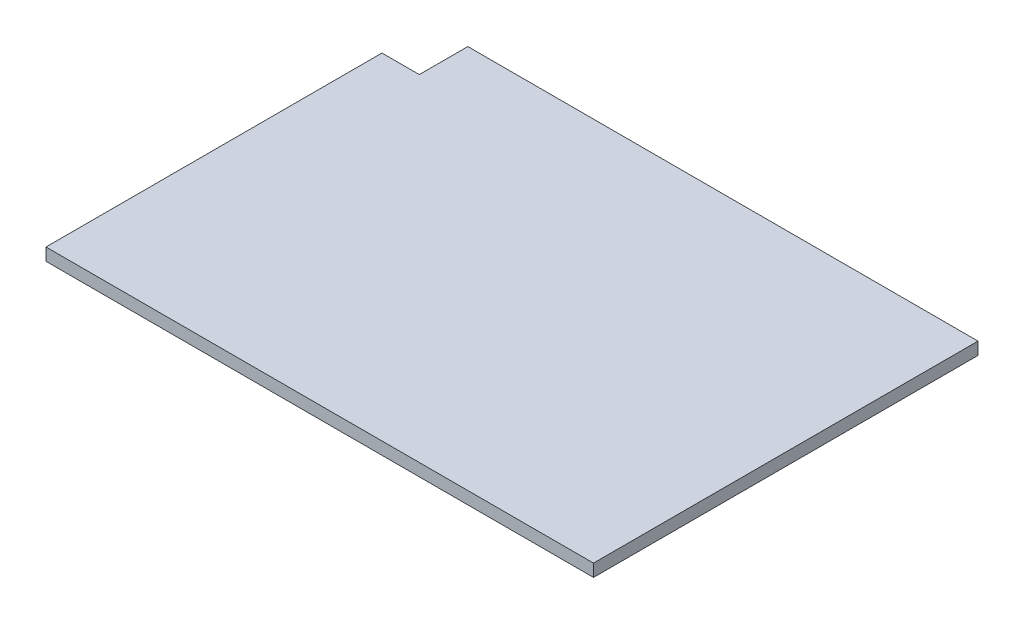
ISO-10303-21;
HEADER;
FILE_DESCRIPTION(('STEP AP214'),'2;1');
FILE_NAME('part.step','',(''),(''),'','','');
FILE_SCHEMA(('AUTOMOTIVE_DESIGN { 1 0 10303 214 1 1 1 1 }'));
ENDSEC;
DATA;
#1=APPLICATION_CONTEXT('core data for automotive mechanical design processes');
#2=APPLICATION_PROTOCOL_DEFINITION('international standard','automotive_design',2000,#1);
#3=PRODUCT_CONTEXT('',#1,'mechanical');
#4=PRODUCT('Part','Part','',(#3));
#5=PRODUCT_RELATED_PRODUCT_CATEGORY('part','',(#4));
#6=PRODUCT_DEFINITION_FORMATION('','',#4);
#7=PRODUCT_DEFINITION_CONTEXT('part definition',#1,'design');
#8=PRODUCT_DEFINITION('design','',#6,#7);
#9=PRODUCT_DEFINITION_SHAPE('','',#8);
#10=(LENGTH_UNIT() NAMED_UNIT(*) SI_UNIT(.MILLI.,.METRE.));
#11=(NAMED_UNIT(*) PLANE_ANGLE_UNIT() SI_UNIT($,.RADIAN.));
#12=(NAMED_UNIT(*) SI_UNIT($,.STERADIAN.) SOLID_ANGLE_UNIT());
#13=UNCERTAINTY_MEASURE_WITH_UNIT(LENGTH_MEASURE(1.E-05),#10,'distance_accuracy_value','');
#14=(GEOMETRIC_REPRESENTATION_CONTEXT(3) GLOBAL_UNCERTAINTY_ASSIGNED_CONTEXT((#13)) GLOBAL_UNIT_ASSIGNED_CONTEXT((#10,
#11,#12)) REPRESENTATION_CONTEXT('',''));
#15=CARTESIAN_POINT('',(0.,0.,0.));
#16=DIRECTION('',(0.,0.,1.));
#17=DIRECTION('',(1.,0.,0.));
#18=AXIS2_PLACEMENT_3D('',#15,#16,#17);
#19=CARTESIAN_POINT('',(0.,10.,0.));
#20=DIRECTION('',(1.,0.,0.));
#21=DIRECTION('',(0.,0.,-1.));
#22=AXIS2_PLACEMENT_3D('',#19,#20,#21);
#23=PLANE('',#22);
#24=DIRECTION('',(0.,0.,1.));
#25=VECTOR('',#24,1.);
#26=CARTESIAN_POINT('',(0.,0.,0.));
#27=LINE('',#26,#25);
#28=CARTESIAN_POINT('',(0.,0.,-270.));
#29=VERTEX_POINT('',#28);
#30=CARTESIAN_POINT('',(0.,0.,0.));
#31=VERTEX_POINT('',#30);
#32=EDGE_CURVE('E128',#29,#31,#27,.T.);
#33=ORIENTED_EDGE('',*,*,#32,.T.);
#34=DIRECTION('',(0.,-1.,0.));
#35=VECTOR('',#34,1.);
#36=CARTESIAN_POINT('',(0.,10.,0.));
#37=LINE('',#36,#35);
#38=CARTESIAN_POINT('',(0.,10.,0.));
#39=VERTEX_POINT('',#38);
#40=EDGE_CURVE('E11',#39,#31,#37,.T.);
#41=ORIENTED_EDGE('',*,*,#40,.F.);
#42=DIRECTION('',(0.,0.,1.));
#43=VECTOR('',#42,1.);
#44=CARTESIAN_POINT('',(0.,10.,0.));
#45=LINE('',#44,#43);
#46=CARTESIAN_POINT('',(0.,10.,-270.));
#47=VERTEX_POINT('',#46);
#48=EDGE_CURVE('E144',#47,#39,#45,.T.);
#49=ORIENTED_EDGE('',*,*,#48,.F.);
#50=DIRECTION('',(0.,-1.,0.));
#51=VECTOR('',#50,1.);
#52=CARTESIAN_POINT('',(0.,10.,-270.));
#53=LINE('',#52,#51);
#54=EDGE_CURVE('E124',#47,#29,#53,.T.);
#55=ORIENTED_EDGE('',*,*,#54,.T.);
#56=EDGE_LOOP('',(#33,#41,#49,#55));
#57=FACE_BOUND('',#56,.T.);
#58=ADVANCED_FACE('F39',(#57),#23,.F.);
#59=CARTESIAN_POINT('',(0.,10.,0.));
#60=DIRECTION('',(0.,0.,-1.));
#61=DIRECTION('',(-1.,0.,0.));
#62=AXIS2_PLACEMENT_3D('',#59,#60,#61);
#63=PLANE('',#62);
#64=DIRECTION('',(1.,0.,0.));
#65=VECTOR('',#64,1.);
#66=CARTESIAN_POINT('',(0.,0.,0.));
#67=LINE('',#66,#65);
#68=CARTESIAN_POINT('',(440.,0.,0.));
#69=VERTEX_POINT('',#68);
#70=EDGE_CURVE('E132',#31,#69,#67,.T.);
#71=ORIENTED_EDGE('',*,*,#70,.T.);
#72=DIRECTION('',(0.,-1.,0.));
#73=VECTOR('',#72,1.);
#74=CARTESIAN_POINT('',(440.,10.,0.));
#75=LINE('',#74,#73);
#76=CARTESIAN_POINT('',(440.,10.,0.));
#77=VERTEX_POINT('',#76);
#78=EDGE_CURVE('E48',#77,#69,#75,.T.);
#79=ORIENTED_EDGE('',*,*,#78,.F.);
#80=DIRECTION('',(1.,0.,0.));
#81=VECTOR('',#80,1.);
#82=CARTESIAN_POINT('',(0.,10.,0.));
#83=LINE('',#82,#81);
#84=EDGE_CURVE('E93',#39,#77,#83,.T.);
#85=ORIENTED_EDGE('',*,*,#84,.F.);
#86=ORIENTED_EDGE('',*,*,#40,.T.);
#87=EDGE_LOOP('',(#71,#79,#85,#86));
#88=FACE_BOUND('',#87,.T.);
#89=ADVANCED_FACE('F172',(#88),#63,.F.);
#90=CARTESIAN_POINT('',(440.,10.,0.));
#91=DIRECTION('',(-1.,0.,0.));
#92=DIRECTION('',(0.,0.,1.));
#93=AXIS2_PLACEMENT_3D('',#90,#91,#92);
#94=PLANE('',#93);
#95=DIRECTION('',(0.,0.,-1.));
#96=VECTOR('',#95,1.);
#97=CARTESIAN_POINT('',(440.,0.,0.));
#98=LINE('',#97,#96);
#99=CARTESIAN_POINT('',(440.,0.,-309.));
#100=VERTEX_POINT('',#99);
#101=EDGE_CURVE('E135',#69,#100,#98,.T.);
#102=ORIENTED_EDGE('',*,*,#101,.T.);
#103=DIRECTION('',(0.,-1.,0.));
#104=VECTOR('',#103,1.);
#105=CARTESIAN_POINT('',(440.,10.,-309.));
#106=LINE('',#105,#104);
#107=CARTESIAN_POINT('',(440.,10.,-309.));
#108=VERTEX_POINT('',#107);
#109=EDGE_CURVE('E117',#108,#100,#106,.T.);
#110=ORIENTED_EDGE('',*,*,#109,.F.);
#111=DIRECTION('',(0.,0.,-1.));
#112=VECTOR('',#111,1.);
#113=CARTESIAN_POINT('',(440.,10.,0.));
#114=LINE('',#113,#112);
#115=EDGE_CURVE('E106',#77,#108,#114,.T.);
#116=ORIENTED_EDGE('',*,*,#115,.F.);
#117=ORIENTED_EDGE('',*,*,#78,.T.);
#118=EDGE_LOOP('',(#102,#110,#116,#117));
#119=FACE_BOUND('',#118,.T.);
#120=ADVANCED_FACE('F154',(#119),#94,.F.);
#121=CARTESIAN_POINT('',(30.,10.,-309.));
#122=DIRECTION('',(0.,0.,1.));
#123=DIRECTION('',(1.,0.,0.));
#124=AXIS2_PLACEMENT_3D('',#121,#122,#123);
#125=PLANE('',#124);
#126=DIRECTION('',(-1.,0.,0.));
#127=VECTOR('',#126,1.);
#128=CARTESIAN_POINT('',(30.,0.,-309.));
#129=LINE('',#128,#127);
#130=CARTESIAN_POINT('',(30.,0.,-309.));
#131=VERTEX_POINT('',#130);
#132=EDGE_CURVE('E115',#100,#131,#129,.T.);
#133=ORIENTED_EDGE('',*,*,#132,.T.);
#134=DIRECTION('',(0.,-1.,0.));
#135=VECTOR('',#134,1.);
#136=CARTESIAN_POINT('',(30.,10.,-309.));
#137=LINE('',#136,#135);
#138=CARTESIAN_POINT('',(30.,10.,-309.));
#139=VERTEX_POINT('',#138);
#140=EDGE_CURVE('E112',#139,#131,#137,.T.);
#141=ORIENTED_EDGE('',*,*,#140,.F.);
#142=DIRECTION('',(-1.,0.,0.));
#143=VECTOR('',#142,1.);
#144=CARTESIAN_POINT('',(30.,10.,-309.));
#145=LINE('',#144,#143);
#146=EDGE_CURVE('E100',#108,#139,#145,.T.);
#147=ORIENTED_EDGE('',*,*,#146,.F.);
#148=ORIENTED_EDGE('',*,*,#109,.T.);
#149=EDGE_LOOP('',(#133,#141,#147,#148));
#150=FACE_BOUND('',#149,.T.);
#151=ADVANCED_FACE('F113',(#150),#125,.F.);
#152=CARTESIAN_POINT('',(30.,10.,-309.));
#153=DIRECTION('',(1.,0.,0.));
#154=DIRECTION('',(0.,0.,-1.));
#155=AXIS2_PLACEMENT_3D('',#152,#153,#154);
#156=PLANE('',#155);
#157=DIRECTION('',(0.,0.,1.));
#158=VECTOR('',#157,1.);
#159=CARTESIAN_POINT('',(30.,0.,-309.));
#160=LINE('',#159,#158);
#161=CARTESIAN_POINT('',(30.,0.,-270.));
#162=VERTEX_POINT('',#161);
#163=EDGE_CURVE('E79',#131,#162,#160,.T.);
#164=ORIENTED_EDGE('',*,*,#163,.T.);
#165=DIRECTION('',(0.,-1.,0.));
#166=VECTOR('',#165,1.);
#167=CARTESIAN_POINT('',(30.,10.,-270.));
#168=LINE('',#167,#166);
#169=CARTESIAN_POINT('',(30.,10.,-270.));
#170=VERTEX_POINT('',#169);
#171=EDGE_CURVE('E118',#170,#162,#168,.T.);
#172=ORIENTED_EDGE('',*,*,#171,.F.);
#173=DIRECTION('',(0.,0.,1.));
#174=VECTOR('',#173,1.);
#175=CARTESIAN_POINT('',(30.,10.,-309.));
#176=LINE('',#175,#174);
#177=EDGE_CURVE('E104',#139,#170,#176,.T.);
#178=ORIENTED_EDGE('',*,*,#177,.F.);
#179=ORIENTED_EDGE('',*,*,#140,.T.);
#180=EDGE_LOOP('',(#164,#172,#178,#179));
#181=FACE_BOUND('',#180,.T.);
#182=ADVANCED_FACE('F120',(#181),#156,.F.);
#183=CARTESIAN_POINT('',(0.,10.,-270.));
#184=DIRECTION('',(0.,0.,1.));
#185=DIRECTION('',(1.,0.,0.));
#186=AXIS2_PLACEMENT_3D('',#183,#184,#185);
#187=PLANE('',#186);
#188=DIRECTION('',(-1.,0.,0.));
#189=VECTOR('',#188,1.);
#190=CARTESIAN_POINT('',(0.,0.,-270.));
#191=LINE('',#190,#189);
#192=EDGE_CURVE('E85',#162,#29,#191,.T.);
#193=ORIENTED_EDGE('',*,*,#192,.T.);
#194=ORIENTED_EDGE('',*,*,#54,.F.);
#195=DIRECTION('',(-1.,0.,0.));
#196=VECTOR('',#195,1.);
#197=CARTESIAN_POINT('',(0.,10.,-270.));
#198=LINE('',#197,#196);
#199=EDGE_CURVE('E56',#170,#47,#198,.T.);
#200=ORIENTED_EDGE('',*,*,#199,.F.);
#201=ORIENTED_EDGE('',*,*,#171,.T.);
#202=EDGE_LOOP('',(#193,#194,#200,#201));
#203=FACE_BOUND('',#202,.T.);
#204=ADVANCED_FACE('F161',(#203),#187,.F.);
#205=CARTESIAN_POINT('',(0.,10.,0.));
#206=DIRECTION('',(0.,-1.,0.));
#207=DIRECTION('',(0.,0.,-1.));
#208=AXIS2_PLACEMENT_3D('',#205,#206,#207);
#209=PLANE('',#208);
#210=ORIENTED_EDGE('',*,*,#48,.T.);
#211=ORIENTED_EDGE('',*,*,#84,.T.);
#212=ORIENTED_EDGE('',*,*,#115,.T.);
#213=ORIENTED_EDGE('',*,*,#146,.T.);
#214=ORIENTED_EDGE('',*,*,#177,.T.);
#215=ORIENTED_EDGE('',*,*,#199,.T.);
#216=EDGE_LOOP('',(#210,#211,#212,#213,#214,#215));
#217=FACE_BOUND('',#216,.T.);
#218=ADVANCED_FACE('F102',(#217),#209,.F.);
#219=CARTESIAN_POINT('',(0.,0.,0.));
#220=DIRECTION('',(0.,-1.,0.));
#221=DIRECTION('',(0.,0.,-1.));
#222=AXIS2_PLACEMENT_3D('',#219,#220,#221);
#223=PLANE('',#222);
#224=ORIENTED_EDGE('',*,*,#32,.F.);
#225=ORIENTED_EDGE('',*,*,#192,.F.);
#226=ORIENTED_EDGE('',*,*,#163,.F.);
#227=ORIENTED_EDGE('',*,*,#132,.F.);
#228=ORIENTED_EDGE('',*,*,#101,.F.);
#229=ORIENTED_EDGE('',*,*,#70,.F.);
#230=EDGE_LOOP('',(#224,#225,#226,#227,#228,#229));
#231=FACE_BOUND('',#230,.T.);
#232=ADVANCED_FACE('F157',(#231),#223,.T.);
#233=CLOSED_SHELL('',(#58,#89,#120,#151,#182,#204,#218,#232));
#234=MANIFOLD_SOLID_BREP('B2',#233);
#235=ADVANCED_BREP_SHAPE_REPRESENTATION('',(#18,#234),#14);
#236=SHAPE_DEFINITION_REPRESENTATION(#9,#235);
ENDSEC;
END-ISO-10303-21;
